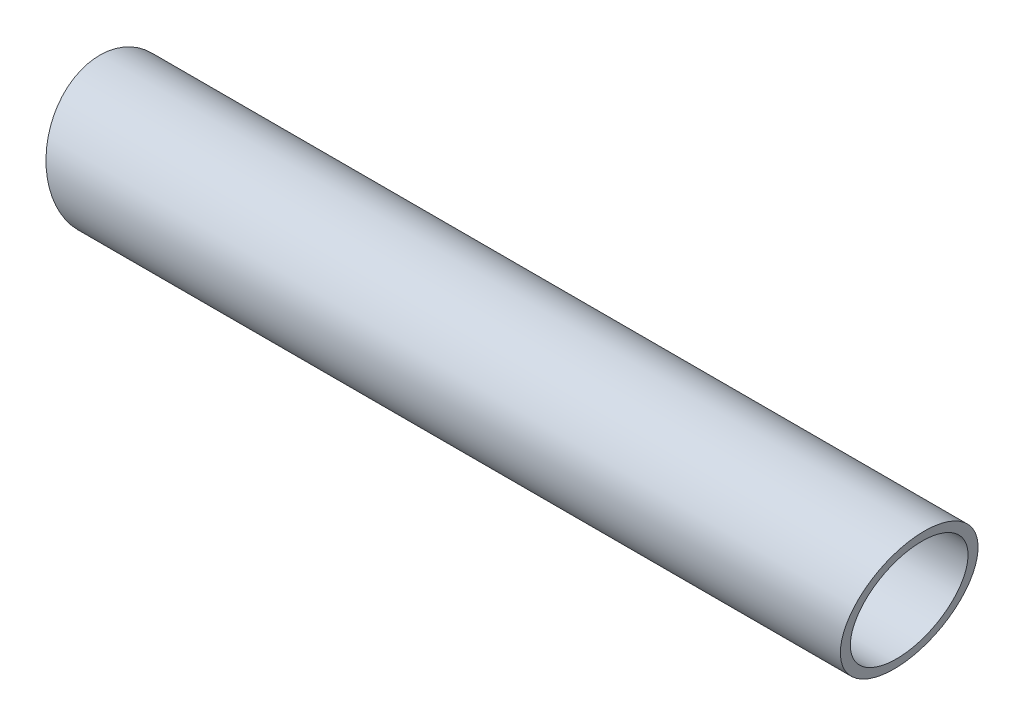
ISO-10303-21;
HEADER;
FILE_DESCRIPTION(('STEP AP214'),'2;1');
FILE_NAME('part.step','',(''),(''),'','','');
FILE_SCHEMA(('AUTOMOTIVE_DESIGN { 1 0 10303 214 1 1 1 1 }'));
ENDSEC;
DATA;
#1=APPLICATION_CONTEXT('core data for automotive mechanical design processes');
#2=APPLICATION_PROTOCOL_DEFINITION('international standard','automotive_design',2000,#1);
#3=PRODUCT_CONTEXT('',#1,'mechanical');
#4=PRODUCT('Part','Part','',(#3));
#5=PRODUCT_RELATED_PRODUCT_CATEGORY('part','',(#4));
#6=PRODUCT_DEFINITION_FORMATION('','',#4);
#7=PRODUCT_DEFINITION_CONTEXT('part definition',#1,'design');
#8=PRODUCT_DEFINITION('design','',#6,#7);
#9=PRODUCT_DEFINITION_SHAPE('','',#8);
#10=(LENGTH_UNIT() NAMED_UNIT(*) SI_UNIT(.MILLI.,.METRE.));
#11=(NAMED_UNIT(*) PLANE_ANGLE_UNIT() SI_UNIT($,.RADIAN.));
#12=(NAMED_UNIT(*) SI_UNIT($,.STERADIAN.) SOLID_ANGLE_UNIT());
#13=UNCERTAINTY_MEASURE_WITH_UNIT(LENGTH_MEASURE(1.E-05),#10,'distance_accuracy_value','');
#14=(GEOMETRIC_REPRESENTATION_CONTEXT(3) GLOBAL_UNCERTAINTY_ASSIGNED_CONTEXT((#13)) GLOBAL_UNIT_ASSIGNED_CONTEXT((#10,
#11,#12)) REPRESENTATION_CONTEXT('',''));
#15=CARTESIAN_POINT('',(0.,0.,0.));
#16=DIRECTION('',(0.,0.,1.));
#17=DIRECTION('',(1.,0.,0.));
#18=AXIS2_PLACEMENT_3D('',#15,#16,#17);
#19=CARTESIAN_POINT('',(-65.0000000000003,539.999999999999,-1140.));
#20=DIRECTION('',(1.,0.,0.));
#21=DIRECTION('',(0.,0.,-1.));
#22=AXIS2_PLACEMENT_3D('',#19,#20,#21);
#23=CYLINDRICAL_SURFACE('',#22,9.39999999999998);
#24=CARTESIAN_POINT('',(-64.9999999999999,539.999999999999,-1140.));
#25=DIRECTION('',(-0.975914622854119,-0.218152810890676,0.));
#26=DIRECTION('',(0.218152810890676,-0.975914622854119,0.));
#27=AXIS2_PLACEMENT_3D('',#24,#25,#26);
#28=ELLIPSE('',#27,9.63199011457491,9.39999999999998);
#29=CARTESIAN_POINT('',(-62.8987542820342,530.599999999999,-1140.));
#30=VERTEX_POINT('',#29);
#31=EDGE_CURVE('E53',#30,#30,#28,.T.);
#32=ORIENTED_EDGE('',*,*,#31,.T.);
#33=EDGE_LOOP('',(#32));
#34=FACE_BOUND('',#33,.T.);
#35=CARTESIAN_POINT('',(64.9999999999999,539.999999999999,-1140.));
#36=DIRECTION('',(0.975914622854119,-0.218152810890675,0.));
#37=DIRECTION('',(0.218152810890675,0.975914622854119,0.));
#38=AXIS2_PLACEMENT_3D('',#35,#36,#37);
#39=ELLIPSE('',#38,9.63199011457491,9.39999999999998);
#40=CARTESIAN_POINT('',(67.1012457179656,549.399999999999,-1140.));
#41=VERTEX_POINT('',#40);
#42=EDGE_CURVE('E43',#41,#41,#39,.T.);
#43=ORIENTED_EDGE('',*,*,#42,.T.);
#44=EDGE_LOOP('',(#43));
#45=FACE_BOUND('',#44,.T.);
#46=ADVANCED_FACE('F39',(#34,#45),#23,.F.);
#47=CARTESIAN_POINT('',(-65.0000000000003,539.999999999999,-1140.));
#48=DIRECTION('',(1.,0.,0.));
#49=DIRECTION('',(0.,0.,-1.));
#50=AXIS2_PLACEMENT_3D('',#47,#48,#49);
#51=CYLINDRICAL_SURFACE('',#50,11.);
#52=CARTESIAN_POINT('',(-64.9999999999999,539.999999999999,-1140.));
#53=DIRECTION('',(-0.975914622854119,-0.218152810890676,0.));
#54=DIRECTION('',(0.218152810890676,-0.975914622854119,0.));
#55=AXIS2_PLACEMENT_3D('',#52,#53,#54);
#56=ELLIPSE('',#55,11.2714777936515,11.);
#57=CARTESIAN_POINT('',(-62.541095436423,528.999999999999,-1140.));
#58=VERTEX_POINT('',#57);
#59=EDGE_CURVE('E47',#58,#58,#56,.T.);
#60=ORIENTED_EDGE('',*,*,#59,.F.);
#61=EDGE_LOOP('',(#60));
#62=FACE_BOUND('',#61,.T.);
#63=CARTESIAN_POINT('',(64.9999999999999,539.999999999999,-1140.));
#64=DIRECTION('',(0.975914622854119,-0.218152810890675,0.));
#65=DIRECTION('',(0.218152810890675,0.975914622854119,0.));
#66=AXIS2_PLACEMENT_3D('',#63,#64,#65);
#67=ELLIPSE('',#66,11.2714777936515,11.);
#68=CARTESIAN_POINT('',(67.4589045635768,550.999999999999,-1140.));
#69=VERTEX_POINT('',#68);
#70=EDGE_CURVE('E10',#69,#69,#67,.T.);
#71=ORIENTED_EDGE('',*,*,#70,.F.);
#72=EDGE_LOOP('',(#71));
#73=FACE_BOUND('',#72,.T.);
#74=ADVANCED_FACE('F67',(#62,#73),#51,.T.);
#75=CARTESIAN_POINT('',(-65.,540.,-1140.));
#76=DIRECTION('',(-0.975914622854119,-0.218152810890676,0.));
#77=DIRECTION('',(0.218152810890676,-0.975914622854119,0.));
#78=AXIS2_PLACEMENT_3D('',#75,#76,#77);
#79=PLANE('',#78);
#80=ORIENTED_EDGE('',*,*,#31,.F.);
#81=EDGE_LOOP('',(#80));
#82=FACE_BOUND('',#81,.T.);
#83=ORIENTED_EDGE('',*,*,#59,.T.);
#84=EDGE_LOOP('',(#83));
#85=FACE_BOUND('',#84,.T.);
#86=ADVANCED_FACE('F62',(#82,#85),#79,.T.);
#87=CARTESIAN_POINT('',(65.,540.,-1140.));
#88=DIRECTION('',(0.975914622854119,-0.218152810890675,0.));
#89=DIRECTION('',(0.218152810890675,0.975914622854119,0.));
#90=AXIS2_PLACEMENT_3D('',#87,#88,#89);
#91=PLANE('',#90);
#92=ORIENTED_EDGE('',*,*,#42,.F.);
#93=EDGE_LOOP('',(#92));
#94=FACE_BOUND('',#93,.T.);
#95=ORIENTED_EDGE('',*,*,#70,.T.);
#96=EDGE_LOOP('',(#95));
#97=FACE_BOUND('',#96,.T.);
#98=ADVANCED_FACE('F41',(#94,#97),#91,.T.);
#99=CLOSED_SHELL('',(#46,#74,#86,#98));
#100=MANIFOLD_SOLID_BREP('B2',#99);
#101=ADVANCED_BREP_SHAPE_REPRESENTATION('',(#18,#100),#14);
#102=SHAPE_DEFINITION_REPRESENTATION(#9,#101);
ENDSEC;
END-ISO-10303-21;
